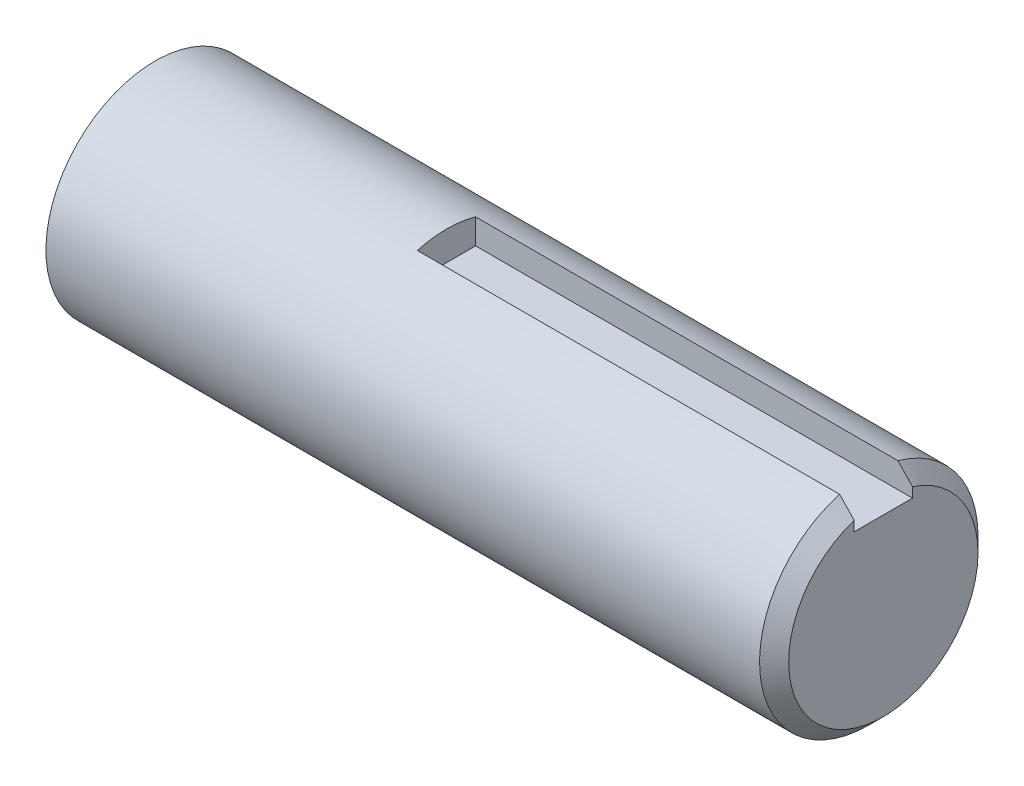
ISO-10303-21;
HEADER;
FILE_DESCRIPTION(('STEP AP214'),'2;1');
FILE_NAME('part.step','',(''),(''),'','','');
FILE_SCHEMA(('AUTOMOTIVE_DESIGN { 1 0 10303 214 1 1 1 1 }'));
ENDSEC;
DATA;
#1=APPLICATION_CONTEXT('core data for automotive mechanical design processes');
#2=APPLICATION_PROTOCOL_DEFINITION('international standard','automotive_design',2000,#1);
#3=PRODUCT_CONTEXT('',#1,'mechanical');
#4=PRODUCT('Part','Part','',(#3));
#5=PRODUCT_RELATED_PRODUCT_CATEGORY('part','',(#4));
#6=PRODUCT_DEFINITION_FORMATION('','',#4);
#7=PRODUCT_DEFINITION_CONTEXT('part definition',#1,'design');
#8=PRODUCT_DEFINITION('design','',#6,#7);
#9=PRODUCT_DEFINITION_SHAPE('','',#8);
#10=(LENGTH_UNIT() NAMED_UNIT(*) SI_UNIT(.MILLI.,.METRE.));
#11=(NAMED_UNIT(*) PLANE_ANGLE_UNIT() SI_UNIT($,.RADIAN.));
#12=(NAMED_UNIT(*) SI_UNIT($,.STERADIAN.) SOLID_ANGLE_UNIT());
#13=UNCERTAINTY_MEASURE_WITH_UNIT(LENGTH_MEASURE(1.E-05),#10,'distance_accuracy_value','');
#14=(GEOMETRIC_REPRESENTATION_CONTEXT(3) GLOBAL_UNCERTAINTY_ASSIGNED_CONTEXT((#13)) GLOBAL_UNIT_ASSIGNED_CONTEXT((#10,
#11,#12)) REPRESENTATION_CONTEXT('',''));
#15=CARTESIAN_POINT('',(0.,0.,0.));
#16=DIRECTION('',(0.,0.,1.));
#17=DIRECTION('',(1.,0.,0.));
#18=AXIS2_PLACEMENT_3D('',#15,#16,#17);
#19=CARTESIAN_POINT('',(50.,0.,0.));
#20=DIRECTION('',(-1.,0.,0.));
#21=DIRECTION('',(0.,0.,1.));
#22=AXIS2_PLACEMENT_3D('',#19,#20,#21);
#23=CYLINDRICAL_SURFACE('',#22,15.);
#24=CARTESIAN_POINT('',(-50.,0.,0.));
#25=DIRECTION('',(1.,0.,0.));
#26=DIRECTION('',(0.,0.,-1.));
#27=AXIS2_PLACEMENT_3D('',#24,#25,#26);
#28=CIRCLE('',#27,15.);
#29=CARTESIAN_POINT('',(-50.,0.,-15.));
#30=VERTEX_POINT('',#29);
#31=EDGE_CURVE('E149',#30,#30,#28,.T.);
#32=ORIENTED_EDGE('',*,*,#31,.T.);
#33=EDGE_LOOP('',(#32));
#34=FACE_BOUND('',#33,.T.);
#35=DIRECTION('',(1.,0.,0.));
#36=VECTOR('',#35,1.);
#37=CARTESIAN_POINT('',(-9.99999999999999,14.456832294801,-4.));
#38=LINE('',#37,#36);
#39=CARTESIAN_POINT('',(-9.99999999999999,14.456832294801,-4.));
#40=VERTEX_POINT('',#39);
#41=CARTESIAN_POINT('',(48.,14.456832294801,-4.));
#42=VERTEX_POINT('',#41);
#43=EDGE_CURVE('E115',#40,#42,#38,.T.);
#44=ORIENTED_EDGE('',*,*,#43,.T.);
#45=CARTESIAN_POINT('',(48.,0.,0.));
#46=DIRECTION('',(1.,0.,0.));
#47=DIRECTION('',(0.,0.,-1.));
#48=AXIS2_PLACEMENT_3D('',#45,#46,#47);
#49=CIRCLE('',#48,15.);
#50=CARTESIAN_POINT('',(48.,14.456832294801,4.));
#51=VERTEX_POINT('',#50);
#52=EDGE_CURVE('E68',#42,#51,#49,.F.);
#53=ORIENTED_EDGE('',*,*,#52,.T.);
#54=DIRECTION('',(1.,0.,0.));
#55=VECTOR('',#54,1.);
#56=CARTESIAN_POINT('',(-9.99999999999999,14.456832294801,4.));
#57=LINE('',#56,#55);
#58=CARTESIAN_POINT('',(-9.99999999999999,14.456832294801,4.));
#59=VERTEX_POINT('',#58);
#60=EDGE_CURVE('E150',#59,#51,#57,.T.);
#61=ORIENTED_EDGE('',*,*,#60,.F.);
#62=CARTESIAN_POINT('',(-9.99999999999999,0.,0.));
#63=DIRECTION('',(1.,0.,0.));
#64=DIRECTION('',(0.,0.,-1.));
#65=AXIS2_PLACEMENT_3D('',#62,#63,#64);
#66=CIRCLE('',#65,15.);
#67=EDGE_CURVE('E125',#40,#59,#66,.T.);
#68=ORIENTED_EDGE('',*,*,#67,.F.);
#69=EDGE_LOOP('',(#44,#53,#61,#68));
#70=FACE_BOUND('',#69,.T.);
#71=ADVANCED_FACE('F52',(#34,#70),#23,.T.);
#72=CARTESIAN_POINT('',(50.,0.,0.));
#73=DIRECTION('',(1.,0.,0.));
#74=DIRECTION('',(0.,0.,-1.));
#75=AXIS2_PLACEMENT_3D('',#72,#73,#74);
#76=PLANE('',#75);
#77=DIRECTION('',(0.,1.,0.));
#78=VECTOR('',#77,1.);
#79=CARTESIAN_POINT('',(50.,0.,4.));
#80=LINE('',#79,#78);
#81=CARTESIAN_POINT('',(50.,11.,4.));
#82=VERTEX_POINT('',#81);
#83=CARTESIAN_POINT('',(50.,12.369316876853,4.));
#84=VERTEX_POINT('',#83);
#85=EDGE_CURVE('E130',#82,#84,#80,.T.);
#86=ORIENTED_EDGE('',*,*,#85,.T.);
#87=CARTESIAN_POINT('',(50.,0.,0.));
#88=DIRECTION('',(1.,0.,0.));
#89=DIRECTION('',(0.,0.,-1.));
#90=AXIS2_PLACEMENT_3D('',#87,#88,#89);
#91=CIRCLE('',#90,13.);
#92=CARTESIAN_POINT('',(50.,12.369316876853,-4.));
#93=VERTEX_POINT('',#92);
#94=EDGE_CURVE('E158',#84,#93,#91,.T.);
#95=ORIENTED_EDGE('',*,*,#94,.T.);
#96=DIRECTION('',(0.,1.,0.));
#97=VECTOR('',#96,1.);
#98=CARTESIAN_POINT('',(50.,0.,-4.));
#99=LINE('',#98,#97);
#100=CARTESIAN_POINT('',(50.,11.,-4.));
#101=VERTEX_POINT('',#100);
#102=EDGE_CURVE('E135',#101,#93,#99,.T.);
#103=ORIENTED_EDGE('',*,*,#102,.F.);
#104=DIRECTION('',(0.,0.,-1.));
#105=VECTOR('',#104,1.);
#106=CARTESIAN_POINT('',(50.,11.,0.));
#107=LINE('',#106,#105);
#108=EDGE_CURVE('E112',#82,#101,#107,.T.);
#109=ORIENTED_EDGE('',*,*,#108,.F.);
#110=EDGE_LOOP('',(#86,#95,#103,#109));
#111=FACE_BOUND('',#110,.T.);
#112=ADVANCED_FACE('F177',(#111),#76,.T.);
#113=CARTESIAN_POINT('',(-50.,0.,0.));
#114=DIRECTION('',(1.,0.,0.));
#115=DIRECTION('',(0.,0.,-1.));
#116=AXIS2_PLACEMENT_3D('',#113,#114,#115);
#117=PLANE('',#116);
#118=ORIENTED_EDGE('',*,*,#31,.F.);
#119=EDGE_LOOP('',(#118));
#120=FACE_BOUND('',#119,.T.);
#121=ADVANCED_FACE('F176',(#120),#117,.F.);
#122=CARTESIAN_POINT('',(-9.99999999999999,11.,0.));
#123=DIRECTION('',(0.,-1.,0.));
#124=DIRECTION('',(0.,0.,-1.));
#125=AXIS2_PLACEMENT_3D('',#122,#123,#124);
#126=PLANE('',#125);
#127=ORIENTED_EDGE('',*,*,#108,.T.);
#128=DIRECTION('',(1.,0.,0.));
#129=VECTOR('',#128,1.);
#130=CARTESIAN_POINT('',(-9.99999999999999,11.,-4.));
#131=LINE('',#130,#129);
#132=CARTESIAN_POINT('',(-9.99999999999999,11.,-4.));
#133=VERTEX_POINT('',#132);
#134=EDGE_CURVE('E106',#133,#101,#131,.T.);
#135=ORIENTED_EDGE('',*,*,#134,.F.);
#136=DIRECTION('',(0.,0.,-1.));
#137=VECTOR('',#136,1.);
#138=CARTESIAN_POINT('',(-9.99999999999999,11.,0.));
#139=LINE('',#138,#137);
#140=CARTESIAN_POINT('',(-9.99999999999999,11.,4.));
#141=VERTEX_POINT('',#140);
#142=EDGE_CURVE('E110',#141,#133,#139,.T.);
#143=ORIENTED_EDGE('',*,*,#142,.F.);
#144=DIRECTION('',(1.,0.,0.));
#145=VECTOR('',#144,1.);
#146=CARTESIAN_POINT('',(-9.99999999999999,11.,4.));
#147=LINE('',#146,#145);
#148=EDGE_CURVE('E146',#141,#82,#147,.T.);
#149=ORIENTED_EDGE('',*,*,#148,.T.);
#150=EDGE_LOOP('',(#127,#135,#143,#149));
#151=FACE_BOUND('',#150,.T.);
#152=ADVANCED_FACE('F108',(#151),#126,.F.);
#153=CARTESIAN_POINT('',(-9.99999999999999,0.,4.));
#154=DIRECTION('',(0.,0.,-1.));
#155=DIRECTION('',(-1.,0.,0.));
#156=AXIS2_PLACEMENT_3D('',#153,#154,#155);
#157=PLANE('',#156);
#158=ORIENTED_EDGE('',*,*,#60,.T.);
#159=CARTESIAN_POINT('',(48.,14.456832294801,4.));
#160=CARTESIAN_POINT('',(48.1671823777064,14.2833673736341,4.));
#161=CARTESIAN_POINT('',(48.3342550704033,14.1097966672148,4.));
#162=CARTESIAN_POINT('',(48.6681527526985,13.7624180287548,4.));
#163=CARTESIAN_POINT('',(48.8349777429273,13.58861009732,4.));
#164=CARTESIAN_POINT('',(49.168352624444,13.2407303813156,4.));
#165=CARTESIAN_POINT('',(49.3349025155927,13.0666585966125,4.));
#166=CARTESIAN_POINT('',(49.6676924866891,12.7182183007377,4.));
#167=CARTESIAN_POINT('',(49.833932565845,12.5438497888099,4.));
#168=CARTESIAN_POINT('',(50.,12.369316876853,4.));
#169=B_SPLINE_CURVE_WITH_KNOTS('',3,(#159,#160,#161,#162,#163,#164,#165,#166,#167,#168),
.UNSPECIFIED.,.F.,.F.,(4,2,2,2,4),(0.,0.722744958615959,1.44548807419885,2.16823155533116,
2.89097688089567),.UNSPECIFIED.);
#170=EDGE_CURVE('E13',#51,#84,#169,.T.);
#171=ORIENTED_EDGE('',*,*,#170,.T.);
#172=ORIENTED_EDGE('',*,*,#85,.F.);
#173=ORIENTED_EDGE('',*,*,#148,.F.);
#174=DIRECTION('',(0.,1.,0.));
#175=VECTOR('',#174,1.);
#176=CARTESIAN_POINT('',(-9.99999999999999,0.,4.));
#177=LINE('',#176,#175);
#178=EDGE_CURVE('E116',#141,#59,#177,.T.);
#179=ORIENTED_EDGE('',*,*,#178,.T.);
#180=EDGE_LOOP('',(#158,#171,#172,#173,#179));
#181=FACE_BOUND('',#180,.T.);
#182=ADVANCED_FACE('F171',(#181),#157,.T.);
#183=CARTESIAN_POINT('',(-9.99999999999999,0.,-4.));
#184=DIRECTION('',(0.,0.,-1.));
#185=DIRECTION('',(-1.,0.,0.));
#186=AXIS2_PLACEMENT_3D('',#183,#184,#185);
#187=PLANE('',#186);
#188=ORIENTED_EDGE('',*,*,#102,.T.);
#189=CARTESIAN_POINT('',(50.,12.369316876853,-4.));
#190=CARTESIAN_POINT('',(49.833932565845,12.5438497888099,-4.));
#191=CARTESIAN_POINT('',(49.6676924866891,12.7182183007377,-4.));
#192=CARTESIAN_POINT('',(49.3349025155927,13.0666585966125,-4.));
#193=CARTESIAN_POINT('',(49.168352624444,13.2407303813156,-4.));
#194=CARTESIAN_POINT('',(48.8349777429273,13.58861009732,-4.));
#195=CARTESIAN_POINT('',(48.6681527526985,13.7624180287548,-4.));
#196=CARTESIAN_POINT('',(48.3342550704033,14.1097966672148,-4.));
#197=CARTESIAN_POINT('',(48.1671823777064,14.2833673736341,-4.));
#198=CARTESIAN_POINT('',(48.,14.456832294801,-4.));
#199=B_SPLINE_CURVE_WITH_KNOTS('',3,(#189,#190,#191,#192,#193,#194,#195,#196,#197,#198),
.UNSPECIFIED.,.F.,.F.,(4,2,2,2,4),(0.,0.722745325564517,1.44548880669682,2.16823192227972,
2.89097688089567),.UNSPECIFIED.);
#200=EDGE_CURVE('E82',#93,#42,#199,.T.);
#201=ORIENTED_EDGE('',*,*,#200,.T.);
#202=ORIENTED_EDGE('',*,*,#43,.F.);
#203=DIRECTION('',(0.,1.,0.));
#204=VECTOR('',#203,1.);
#205=CARTESIAN_POINT('',(-9.99999999999999,0.,-4.));
#206=LINE('',#205,#204);
#207=EDGE_CURVE('E119',#133,#40,#206,.T.);
#208=ORIENTED_EDGE('',*,*,#207,.F.);
#209=ORIENTED_EDGE('',*,*,#134,.T.);
#210=EDGE_LOOP('',(#188,#201,#202,#208,#209));
#211=FACE_BOUND('',#210,.T.);
#212=ADVANCED_FACE('F120',(#211),#187,.F.);
#213=CARTESIAN_POINT('',(-9.99999999999999,0.,0.));
#214=DIRECTION('',(1.,0.,0.));
#215=DIRECTION('',(0.,0.,-1.));
#216=AXIS2_PLACEMENT_3D('',#213,#214,#215);
#217=PLANE('',#216);
#218=ORIENTED_EDGE('',*,*,#142,.T.);
#219=ORIENTED_EDGE('',*,*,#207,.T.);
#220=ORIENTED_EDGE('',*,*,#67,.T.);
#221=ORIENTED_EDGE('',*,*,#178,.F.);
#222=EDGE_LOOP('',(#218,#219,#220,#221));
#223=FACE_BOUND('',#222,.T.);
#224=ADVANCED_FACE('F128',(#223),#217,.T.);
#225=CARTESIAN_POINT('',(50.,0.,0.));
#226=DIRECTION('',(-1.,0.,0.));
#227=DIRECTION('',(0.,0.,1.));
#228=AXIS2_PLACEMENT_3D('',#225,#226,#227);
#229=CONICAL_SURFACE('',#228,13.,0.785398163397445);
#230=ORIENTED_EDGE('',*,*,#170,.F.);
#231=ORIENTED_EDGE('',*,*,#52,.F.);
#232=ORIENTED_EDGE('',*,*,#200,.F.);
#233=ORIENTED_EDGE('',*,*,#94,.F.);
#234=EDGE_LOOP('',(#230,#231,#232,#233));
#235=FACE_BOUND('',#234,.T.);
#236=ADVANCED_FACE('F55',(#235),#229,.T.);
#237=CLOSED_SHELL('',(#71,#112,#121,#152,#182,#212,#224,#236));
#238=MANIFOLD_SOLID_BREP('B2',#237);
#239=ADVANCED_BREP_SHAPE_REPRESENTATION('',(#18,#238),#14);
#240=SHAPE_DEFINITION_REPRESENTATION(#9,#239);
ENDSEC;
END-ISO-10303-21;
